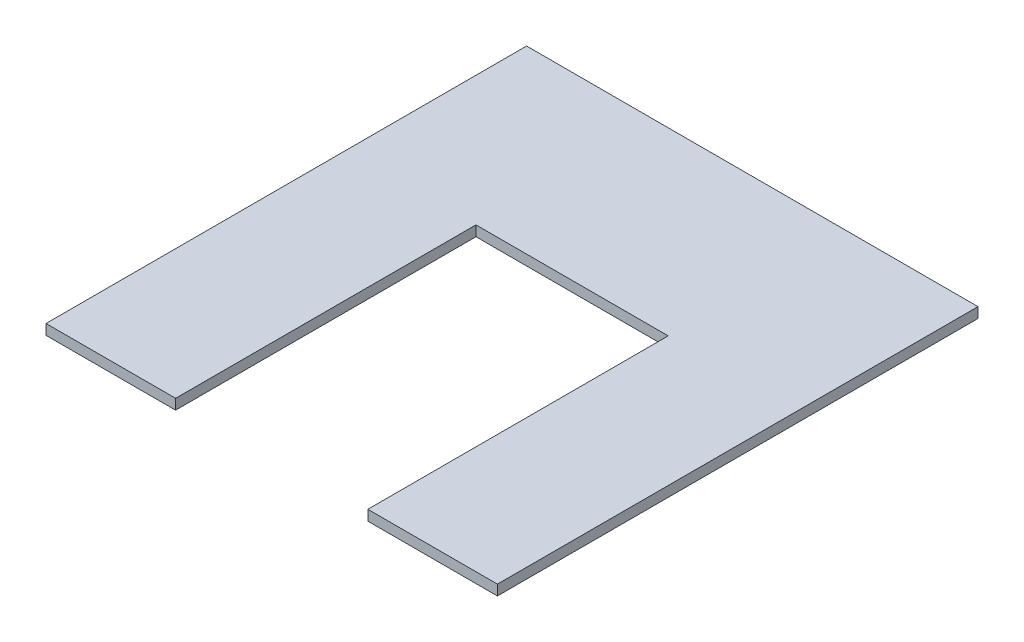
ISO-10303-21;
HEADER;
FILE_DESCRIPTION(('STEP AP214'),'2;1');
FILE_NAME('part.step','',(''),(''),'','','');
FILE_SCHEMA(('AUTOMOTIVE_DESIGN { 1 0 10303 214 1 1 1 1 }'));
ENDSEC;
DATA;
#1=APPLICATION_CONTEXT('core data for automotive mechanical design processes');
#2=APPLICATION_PROTOCOL_DEFINITION('international standard','automotive_design',2000,#1);
#3=PRODUCT_CONTEXT('',#1,'mechanical');
#4=PRODUCT('Part','Part','',(#3));
#5=PRODUCT_RELATED_PRODUCT_CATEGORY('part','',(#4));
#6=PRODUCT_DEFINITION_FORMATION('','',#4);
#7=PRODUCT_DEFINITION_CONTEXT('part definition',#1,'design');
#8=PRODUCT_DEFINITION('design','',#6,#7);
#9=PRODUCT_DEFINITION_SHAPE('','',#8);
#10=(LENGTH_UNIT() NAMED_UNIT(*) SI_UNIT(.MILLI.,.METRE.));
#11=(NAMED_UNIT(*) PLANE_ANGLE_UNIT() SI_UNIT($,.RADIAN.));
#12=(NAMED_UNIT(*) SI_UNIT($,.STERADIAN.) SOLID_ANGLE_UNIT());
#13=UNCERTAINTY_MEASURE_WITH_UNIT(LENGTH_MEASURE(1.E-05),#10,'distance_accuracy_value','');
#14=(GEOMETRIC_REPRESENTATION_CONTEXT(3) GLOBAL_UNCERTAINTY_ASSIGNED_CONTEXT((#13)) GLOBAL_UNIT_ASSIGNED_CONTEXT((#10,
#11,#12)) REPRESENTATION_CONTEXT('',''));
#15=CARTESIAN_POINT('',(0.,0.,0.));
#16=DIRECTION('',(0.,0.,1.));
#17=DIRECTION('',(1.,0.,0.));
#18=AXIS2_PLACEMENT_3D('',#15,#16,#17);
#19=CARTESIAN_POINT('',(22.149321620263,6.,-128.939042428149));
#20=DIRECTION('',(0.,0.,1.));
#21=DIRECTION('',(1.,0.,0.));
#22=AXIS2_PLACEMENT_3D('',#19,#20,#21);
#23=PLANE('',#22);
#24=DIRECTION('',(-1.,0.,0.));
#25=VECTOR('',#24,1.);
#26=CARTESIAN_POINT('',(22.149321620263,0.,-128.939042428149));
#27=LINE('',#26,#25);
#28=CARTESIAN_POINT('',(285.149321620263,0.,-128.939042428149));
#29=VERTEX_POINT('',#28);
#30=CARTESIAN_POINT('',(22.149321620263,0.,-128.939042428149));
#31=VERTEX_POINT('',#30);
#32=EDGE_CURVE('E144',#29,#31,#27,.T.);
#33=ORIENTED_EDGE('',*,*,#32,.T.);
#34=DIRECTION('',(0.,-1.,0.));
#35=VECTOR('',#34,1.);
#36=CARTESIAN_POINT('',(22.149321620263,6.,-128.939042428149));
#37=LINE('',#36,#35);
#38=CARTESIAN_POINT('',(22.149321620263,6.,-128.939042428149));
#39=VERTEX_POINT('',#38);
#40=EDGE_CURVE('E11',#39,#31,#37,.T.);
#41=ORIENTED_EDGE('',*,*,#40,.F.);
#42=DIRECTION('',(-1.,0.,0.));
#43=VECTOR('',#42,1.);
#44=CARTESIAN_POINT('',(22.149321620263,6.,-128.939042428149));
#45=LINE('',#44,#43);
#46=CARTESIAN_POINT('',(285.149321620263,6.,-128.939042428149));
#47=VERTEX_POINT('',#46);
#48=EDGE_CURVE('E166',#47,#39,#45,.T.);
#49=ORIENTED_EDGE('',*,*,#48,.F.);
#50=DIRECTION('',(0.,-1.,0.));
#51=VECTOR('',#50,1.);
#52=CARTESIAN_POINT('',(285.149321620263,6.,-128.939042428149));
#53=LINE('',#52,#51);
#54=EDGE_CURVE('E140',#47,#29,#53,.T.);
#55=ORIENTED_EDGE('',*,*,#54,.T.);
#56=EDGE_LOOP('',(#33,#41,#49,#55));
#57=FACE_BOUND('',#56,.T.);
#58=ADVANCED_FACE('F43',(#57),#23,.F.);
#59=CARTESIAN_POINT('',(22.149321620263,6.,-128.939042428149));
#60=DIRECTION('',(1.,0.,0.));
#61=DIRECTION('',(0.,0.,-1.));
#62=AXIS2_PLACEMENT_3D('',#59,#60,#61);
#63=PLANE('',#62);
#64=DIRECTION('',(0.,0.,1.));
#65=VECTOR('',#64,1.);
#66=CARTESIAN_POINT('',(22.149321620263,0.,-128.939042428149));
#67=LINE('',#66,#65);
#68=CARTESIAN_POINT('',(22.149321620263,0.,151.060957571851));
#69=VERTEX_POINT('',#68);
#70=EDGE_CURVE('E148',#31,#69,#67,.T.);
#71=ORIENTED_EDGE('',*,*,#70,.T.);
#72=DIRECTION('',(0.,-1.,0.));
#73=VECTOR('',#72,1.);
#74=CARTESIAN_POINT('',(22.149321620263,6.,151.060957571851));
#75=LINE('',#74,#73);
#76=CARTESIAN_POINT('',(22.149321620263,6.,151.060957571851));
#77=VERTEX_POINT('',#76);
#78=EDGE_CURVE('E52',#77,#69,#75,.T.);
#79=ORIENTED_EDGE('',*,*,#78,.F.);
#80=DIRECTION('',(0.,0.,1.));
#81=VECTOR('',#80,1.);
#82=CARTESIAN_POINT('',(22.149321620263,6.,-128.939042428149));
#83=LINE('',#82,#81);
#84=EDGE_CURVE('E103',#39,#77,#83,.T.);
#85=ORIENTED_EDGE('',*,*,#84,.F.);
#86=ORIENTED_EDGE('',*,*,#40,.T.);
#87=EDGE_LOOP('',(#71,#79,#85,#86));
#88=FACE_BOUND('',#87,.T.);
#89=ADVANCED_FACE('F212',(#88),#63,.F.);
#90=CARTESIAN_POINT('',(22.149321620263,6.,151.060957571851));
#91=DIRECTION('',(0.,0.,-1.));
#92=DIRECTION('',(-1.,0.,0.));
#93=AXIS2_PLACEMENT_3D('',#90,#91,#92);
#94=PLANE('',#93);
#95=DIRECTION('',(1.,0.,0.));
#96=VECTOR('',#95,1.);
#97=CARTESIAN_POINT('',(22.149321620263,0.,151.060957571851));
#98=LINE('',#97,#96);
#99=CARTESIAN_POINT('',(97.649321620263,0.,151.060957571851));
#100=VERTEX_POINT('',#99);
#101=EDGE_CURVE('E151',#69,#100,#98,.T.);
#102=ORIENTED_EDGE('',*,*,#101,.T.);
#103=DIRECTION('',(0.,-1.,0.));
#104=VECTOR('',#103,1.);
#105=CARTESIAN_POINT('',(97.649321620263,6.,151.060957571851));
#106=LINE('',#105,#104);
#107=CARTESIAN_POINT('',(97.649321620263,6.,151.060957571851));
#108=VERTEX_POINT('',#107);
#109=EDGE_CURVE('E177',#108,#100,#106,.T.);
#110=ORIENTED_EDGE('',*,*,#109,.F.);
#111=DIRECTION('',(1.,0.,0.));
#112=VECTOR('',#111,1.);
#113=CARTESIAN_POINT('',(22.149321620263,6.,151.060957571851));
#114=LINE('',#113,#112);
#115=EDGE_CURVE('E187',#77,#108,#114,.T.);
#116=ORIENTED_EDGE('',*,*,#115,.F.);
#117=ORIENTED_EDGE('',*,*,#78,.T.);
#118=EDGE_LOOP('',(#102,#110,#116,#117));
#119=FACE_BOUND('',#118,.T.);
#120=ADVANCED_FACE('F185',(#119),#94,.F.);
#121=CARTESIAN_POINT('',(97.649321620263,6.,151.060957571851));
#122=DIRECTION('',(-1.,0.,0.));
#123=DIRECTION('',(0.,0.,1.));
#124=AXIS2_PLACEMENT_3D('',#121,#122,#123);
#125=PLANE('',#124);
#126=DIRECTION('',(0.,0.,-1.));
#127=VECTOR('',#126,1.);
#128=CARTESIAN_POINT('',(97.649321620263,0.,151.060957571851));
#129=LINE('',#128,#127);
#130=CARTESIAN_POINT('',(97.649321620263,0.,-23.9390424281488));
#131=VERTEX_POINT('',#130);
#132=EDGE_CURVE('E154',#100,#131,#129,.T.);
#133=ORIENTED_EDGE('',*,*,#132,.T.);
#134=DIRECTION('',(0.,-1.,0.));
#135=VECTOR('',#134,1.);
#136=CARTESIAN_POINT('',(97.649321620263,6.,-23.9390424281488));
#137=LINE('',#136,#135);
#138=CARTESIAN_POINT('',(97.649321620263,6.,-23.9390424281488));
#139=VERTEX_POINT('',#138);
#140=EDGE_CURVE('E173',#139,#131,#137,.T.);
#141=ORIENTED_EDGE('',*,*,#140,.F.);
#142=DIRECTION('',(0.,0.,-1.));
#143=VECTOR('',#142,1.);
#144=CARTESIAN_POINT('',(97.649321620263,6.,151.060957571851));
#145=LINE('',#144,#143);
#146=EDGE_CURVE('E200',#108,#139,#145,.T.);
#147=ORIENTED_EDGE('',*,*,#146,.F.);
#148=ORIENTED_EDGE('',*,*,#109,.T.);
#149=EDGE_LOOP('',(#133,#141,#147,#148));
#150=FACE_BOUND('',#149,.T.);
#151=ADVANCED_FACE('F195',(#150),#125,.F.);
#152=CARTESIAN_POINT('',(209.649321620263,6.,-23.9390424281488));
#153=DIRECTION('',(0.,0.,-1.));
#154=DIRECTION('',(-1.,0.,0.));
#155=AXIS2_PLACEMENT_3D('',#152,#153,#154);
#156=PLANE('',#155);
#157=DIRECTION('',(1.,0.,0.));
#158=VECTOR('',#157,1.);
#159=CARTESIAN_POINT('',(209.649321620263,0.,-23.9390424281488));
#160=LINE('',#159,#158);
#161=CARTESIAN_POINT('',(209.649321620263,0.,-23.9390424281488));
#162=VERTEX_POINT('',#161);
#163=EDGE_CURVE('E157',#131,#162,#160,.T.);
#164=ORIENTED_EDGE('',*,*,#163,.T.);
#165=DIRECTION('',(0.,-1.,0.));
#166=VECTOR('',#165,1.);
#167=CARTESIAN_POINT('',(209.649321620263,6.,-23.9390424281488));
#168=LINE('',#167,#166);
#169=CARTESIAN_POINT('',(209.649321620263,6.,-23.9390424281488));
#170=VERTEX_POINT('',#169);
#171=EDGE_CURVE('E133',#170,#162,#168,.T.);
#172=ORIENTED_EDGE('',*,*,#171,.F.);
#173=DIRECTION('',(1.,0.,0.));
#174=VECTOR('',#173,1.);
#175=CARTESIAN_POINT('',(209.649321620263,6.,-23.9390424281488));
#176=LINE('',#175,#174);
#177=EDGE_CURVE('E122',#139,#170,#176,.T.);
#178=ORIENTED_EDGE('',*,*,#177,.F.);
#179=ORIENTED_EDGE('',*,*,#140,.T.);
#180=EDGE_LOOP('',(#164,#172,#178,#179));
#181=FACE_BOUND('',#180,.T.);
#182=ADVANCED_FACE('F198',(#181),#156,.F.);
#183=CARTESIAN_POINT('',(209.649321620263,6.,151.060957571851));
#184=DIRECTION('',(1.,0.,0.));
#185=DIRECTION('',(0.,0.,-1.));
#186=AXIS2_PLACEMENT_3D('',#183,#184,#185);
#187=PLANE('',#186);
#188=DIRECTION('',(0.,0.,1.));
#189=VECTOR('',#188,1.);
#190=CARTESIAN_POINT('',(209.649321620263,0.,151.060957571851));
#191=LINE('',#190,#189);
#192=CARTESIAN_POINT('',(209.649321620263,0.,151.060957571851));
#193=VERTEX_POINT('',#192);
#194=EDGE_CURVE('E131',#162,#193,#191,.T.);
#195=ORIENTED_EDGE('',*,*,#194,.T.);
#196=DIRECTION('',(0.,-1.,0.));
#197=VECTOR('',#196,1.);
#198=CARTESIAN_POINT('',(209.649321620263,6.,151.060957571851));
#199=LINE('',#198,#197);
#200=CARTESIAN_POINT('',(209.649321620263,6.,151.060957571851));
#201=VERTEX_POINT('',#200);
#202=EDGE_CURVE('E128',#201,#193,#199,.T.);
#203=ORIENTED_EDGE('',*,*,#202,.F.);
#204=DIRECTION('',(0.,0.,1.));
#205=VECTOR('',#204,1.);
#206=CARTESIAN_POINT('',(209.649321620263,6.,151.060957571851));
#207=LINE('',#206,#205);
#208=EDGE_CURVE('E116',#170,#201,#207,.T.);
#209=ORIENTED_EDGE('',*,*,#208,.F.);
#210=ORIENTED_EDGE('',*,*,#171,.T.);
#211=EDGE_LOOP('',(#195,#203,#209,#210));
#212=FACE_BOUND('',#211,.T.);
#213=ADVANCED_FACE('F129',(#212),#187,.F.);
#214=CARTESIAN_POINT('',(285.149321620263,6.,151.060957571851));
#215=DIRECTION('',(0.,0.,-1.));
#216=DIRECTION('',(-1.,0.,0.));
#217=AXIS2_PLACEMENT_3D('',#214,#215,#216);
#218=PLANE('',#217);
#219=DIRECTION('',(1.,0.,0.));
#220=VECTOR('',#219,1.);
#221=CARTESIAN_POINT('',(285.149321620263,0.,151.060957571851));
#222=LINE('',#221,#220);
#223=CARTESIAN_POINT('',(285.149321620263,0.,151.060957571851));
#224=VERTEX_POINT('',#223);
#225=EDGE_CURVE('E89',#193,#224,#222,.T.);
#226=ORIENTED_EDGE('',*,*,#225,.T.);
#227=DIRECTION('',(0.,-1.,0.));
#228=VECTOR('',#227,1.);
#229=CARTESIAN_POINT('',(285.149321620263,6.,151.060957571851));
#230=LINE('',#229,#228);
#231=CARTESIAN_POINT('',(285.149321620263,6.,151.060957571851));
#232=VERTEX_POINT('',#231);
#233=EDGE_CURVE('E134',#232,#224,#230,.T.);
#234=ORIENTED_EDGE('',*,*,#233,.F.);
#235=DIRECTION('',(1.,0.,0.));
#236=VECTOR('',#235,1.);
#237=CARTESIAN_POINT('',(285.149321620263,6.,151.060957571851));
#238=LINE('',#237,#236);
#239=EDGE_CURVE('E120',#201,#232,#238,.T.);
#240=ORIENTED_EDGE('',*,*,#239,.F.);
#241=ORIENTED_EDGE('',*,*,#202,.T.);
#242=EDGE_LOOP('',(#226,#234,#240,#241));
#243=FACE_BOUND('',#242,.T.);
#244=ADVANCED_FACE('F136',(#243),#218,.F.);
#245=CARTESIAN_POINT('',(285.149321620263,6.,-128.939042428149));
#246=DIRECTION('',(-1.,0.,0.));
#247=DIRECTION('',(0.,0.,1.));
#248=AXIS2_PLACEMENT_3D('',#245,#246,#247);
#249=PLANE('',#248);
#250=DIRECTION('',(0.,0.,-1.));
#251=VECTOR('',#250,1.);
#252=CARTESIAN_POINT('',(285.149321620263,0.,-128.939042428149));
#253=LINE('',#252,#251);
#254=EDGE_CURVE('E95',#224,#29,#253,.T.);
#255=ORIENTED_EDGE('',*,*,#254,.T.);
#256=ORIENTED_EDGE('',*,*,#54,.F.);
#257=DIRECTION('',(0.,0.,-1.));
#258=VECTOR('',#257,1.);
#259=CARTESIAN_POINT('',(285.149321620263,6.,-128.939042428149));
#260=LINE('',#259,#258);
#261=EDGE_CURVE('E60',#232,#47,#260,.T.);
#262=ORIENTED_EDGE('',*,*,#261,.F.);
#263=ORIENTED_EDGE('',*,*,#233,.T.);
#264=EDGE_LOOP('',(#255,#256,#262,#263));
#265=FACE_BOUND('',#264,.T.);
#266=ADVANCED_FACE('F228',(#265),#249,.F.);
#267=CARTESIAN_POINT('',(0.,6.,0.));
#268=DIRECTION('',(0.,-1.,0.));
#269=DIRECTION('',(0.,0.,-1.));
#270=AXIS2_PLACEMENT_3D('',#267,#268,#269);
#271=PLANE('',#270);
#272=ORIENTED_EDGE('',*,*,#48,.T.);
#273=ORIENTED_EDGE('',*,*,#84,.T.);
#274=ORIENTED_EDGE('',*,*,#115,.T.);
#275=ORIENTED_EDGE('',*,*,#146,.T.);
#276=ORIENTED_EDGE('',*,*,#177,.T.);
#277=ORIENTED_EDGE('',*,*,#208,.T.);
#278=ORIENTED_EDGE('',*,*,#239,.T.);
#279=ORIENTED_EDGE('',*,*,#261,.T.);
#280=EDGE_LOOP('',(#272,#273,#274,#275,#276,#277,#278,#279));
#281=FACE_BOUND('',#280,.T.);
#282=ADVANCED_FACE('F118',(#281),#271,.F.);
#283=CARTESIAN_POINT('',(0.,0.,0.));
#284=DIRECTION('',(0.,-1.,0.));
#285=DIRECTION('',(0.,0.,-1.));
#286=AXIS2_PLACEMENT_3D('',#283,#284,#285);
#287=PLANE('',#286);
#288=ORIENTED_EDGE('',*,*,#32,.F.);
#289=ORIENTED_EDGE('',*,*,#254,.F.);
#290=ORIENTED_EDGE('',*,*,#225,.F.);
#291=ORIENTED_EDGE('',*,*,#194,.F.);
#292=ORIENTED_EDGE('',*,*,#163,.F.);
#293=ORIENTED_EDGE('',*,*,#132,.F.);
#294=ORIENTED_EDGE('',*,*,#101,.F.);
#295=ORIENTED_EDGE('',*,*,#70,.F.);
#296=EDGE_LOOP('',(#288,#289,#290,#291,#292,#293,#294,#295));
#297=FACE_BOUND('',#296,.T.);
#298=ADVANCED_FACE('F191',(#297),#287,.T.);
#299=CLOSED_SHELL('',(#58,#89,#120,#151,#182,#213,#244,#266,#282,#298));
#300=MANIFOLD_SOLID_BREP('B2',#299);
#301=ADVANCED_BREP_SHAPE_REPRESENTATION('',(#18,#300),#14);
#302=SHAPE_DEFINITION_REPRESENTATION(#9,#301);
ENDSEC;
END-ISO-10303-21;
